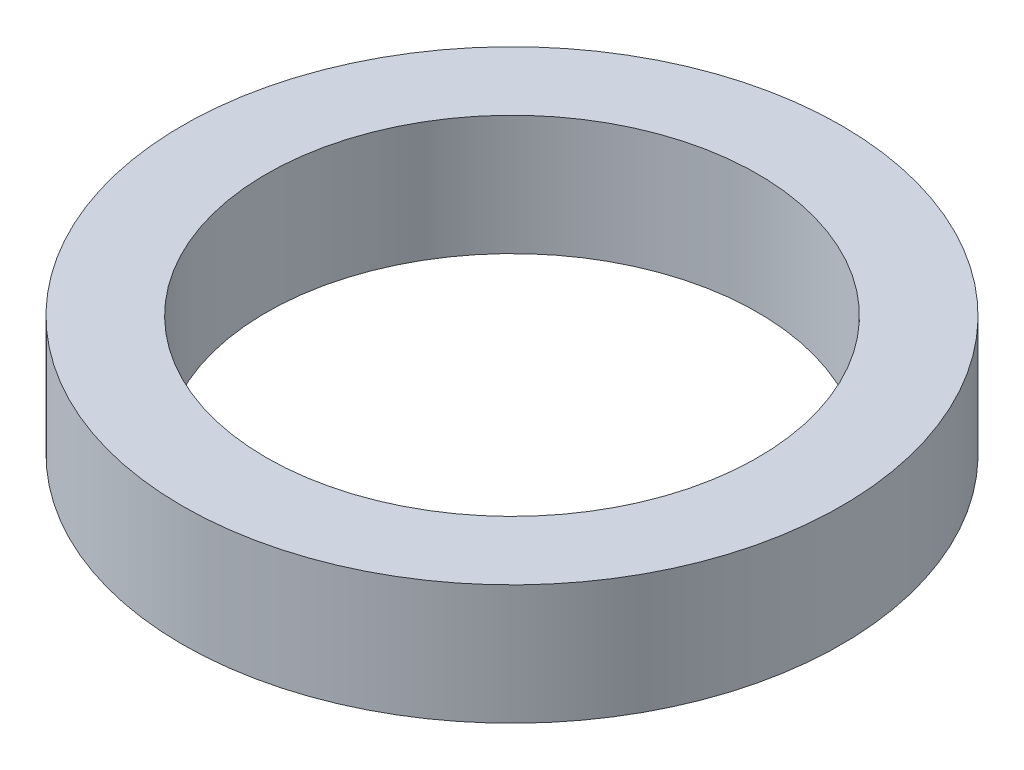
ISO-10303-21;
HEADER;
FILE_DESCRIPTION(('STEP AP214'),'2;1');
FILE_NAME('part.step','',(''),(''),'','','');
FILE_SCHEMA(('AUTOMOTIVE_DESIGN { 1 0 10303 214 1 1 1 1 }'));
ENDSEC;
DATA;
#1=APPLICATION_CONTEXT('core data for automotive mechanical design processes');
#2=APPLICATION_PROTOCOL_DEFINITION('international standard','automotive_design',2000,#1);
#3=PRODUCT_CONTEXT('',#1,'mechanical');
#4=PRODUCT('Part','Part','',(#3));
#5=PRODUCT_RELATED_PRODUCT_CATEGORY('part','',(#4));
#6=PRODUCT_DEFINITION_FORMATION('','',#4);
#7=PRODUCT_DEFINITION_CONTEXT('part definition',#1,'design');
#8=PRODUCT_DEFINITION('design','',#6,#7);
#9=PRODUCT_DEFINITION_SHAPE('','',#8);
#10=(LENGTH_UNIT() NAMED_UNIT(*) SI_UNIT(.MILLI.,.METRE.));
#11=(NAMED_UNIT(*) PLANE_ANGLE_UNIT() SI_UNIT($,.RADIAN.));
#12=(NAMED_UNIT(*) SI_UNIT($,.STERADIAN.) SOLID_ANGLE_UNIT());
#13=UNCERTAINTY_MEASURE_WITH_UNIT(LENGTH_MEASURE(1.E-05),#10,'distance_accuracy_value','');
#14=(GEOMETRIC_REPRESENTATION_CONTEXT(3) GLOBAL_UNCERTAINTY_ASSIGNED_CONTEXT((#13)) GLOBAL_UNIT_ASSIGNED_CONTEXT((#10,
#11,#12)) REPRESENTATION_CONTEXT('',''));
#15=CARTESIAN_POINT('',(0.,0.,0.));
#16=DIRECTION('',(0.,0.,1.));
#17=DIRECTION('',(1.,0.,0.));
#18=AXIS2_PLACEMENT_3D('',#15,#16,#17);
#19=CARTESIAN_POINT('',(0.,1.,0.));
#20=DIRECTION('',(0.,1.,0.));
#21=DIRECTION('',(0.,0.,1.));
#22=AXIS2_PLACEMENT_3D('',#19,#20,#21);
#23=PLANE('',#22);
#24=CARTESIAN_POINT('',(0.,1.,0.));
#25=DIRECTION('',(0.,1.,0.));
#26=DIRECTION('',(0.,0.,1.));
#27=AXIS2_PLACEMENT_3D('',#24,#25,#26);
#28=CIRCLE('',#27,2.75);
#29=CARTESIAN_POINT('',(0.,1.,2.75));
#30=VERTEX_POINT('',#29);
#31=EDGE_CURVE('E10',#30,#30,#28,.T.);
#32=ORIENTED_EDGE('',*,*,#31,.T.);
#33=EDGE_LOOP('',(#32));
#34=FACE_BOUND('',#33,.T.);
#35=CARTESIAN_POINT('',(0.,1.,0.));
#36=DIRECTION('',(0.,1.,0.));
#37=DIRECTION('',(0.,0.,1.));
#38=AXIS2_PLACEMENT_3D('',#35,#36,#37);
#39=CIRCLE('',#38,2.05);
#40=CARTESIAN_POINT('',(0.,1.,2.05));
#41=VERTEX_POINT('',#40);
#42=EDGE_CURVE('E42',#41,#41,#39,.T.);
#43=ORIENTED_EDGE('',*,*,#42,.F.);
#44=EDGE_LOOP('',(#43));
#45=FACE_BOUND('',#44,.T.);
#46=ADVANCED_FACE('F31',(#34,#45),#23,.T.);
#47=CARTESIAN_POINT('',(0.,0.,0.));
#48=DIRECTION('',(0.,1.,0.));
#49=DIRECTION('',(0.,0.,1.));
#50=AXIS2_PLACEMENT_3D('',#47,#48,#49);
#51=PLANE('',#50);
#52=CARTESIAN_POINT('',(0.,0.,0.));
#53=DIRECTION('',(0.,1.,0.));
#54=DIRECTION('',(0.,0.,1.));
#55=AXIS2_PLACEMENT_3D('',#52,#53,#54);
#56=CIRCLE('',#55,2.75);
#57=CARTESIAN_POINT('',(0.,0.,2.75));
#58=VERTEX_POINT('',#57);
#59=EDGE_CURVE('E35',#58,#58,#56,.T.);
#60=ORIENTED_EDGE('',*,*,#59,.F.);
#61=EDGE_LOOP('',(#60));
#62=FACE_BOUND('',#61,.T.);
#63=CARTESIAN_POINT('',(0.,0.,0.));
#64=DIRECTION('',(0.,1.,0.));
#65=DIRECTION('',(0.,0.,1.));
#66=AXIS2_PLACEMENT_3D('',#63,#64,#65);
#67=CIRCLE('',#66,2.05);
#68=CARTESIAN_POINT('',(0.,0.,2.05));
#69=VERTEX_POINT('',#68);
#70=EDGE_CURVE('E44',#69,#69,#67,.T.);
#71=ORIENTED_EDGE('',*,*,#70,.T.);
#72=EDGE_LOOP('',(#71));
#73=FACE_BOUND('',#72,.T.);
#74=ADVANCED_FACE('F54',(#62,#73),#51,.F.);
#75=CARTESIAN_POINT('',(0.,1.,0.));
#76=DIRECTION('',(0.,-1.,0.));
#77=DIRECTION('',(0.,0.,-1.));
#78=AXIS2_PLACEMENT_3D('',#75,#76,#77);
#79=CYLINDRICAL_SURFACE('',#78,2.75);
#80=ORIENTED_EDGE('',*,*,#31,.F.);
#81=EDGE_LOOP('',(#80));
#82=FACE_BOUND('',#81,.T.);
#83=ORIENTED_EDGE('',*,*,#59,.T.);
#84=EDGE_LOOP('',(#83));
#85=FACE_BOUND('',#84,.T.);
#86=ADVANCED_FACE('F33',(#82,#85),#79,.T.);
#87=CARTESIAN_POINT('',(0.,1.,0.));
#88=DIRECTION('',(0.,-1.,0.));
#89=DIRECTION('',(0.,0.,-1.));
#90=AXIS2_PLACEMENT_3D('',#87,#88,#89);
#91=CYLINDRICAL_SURFACE('',#90,2.05);
#92=ORIENTED_EDGE('',*,*,#42,.T.);
#93=EDGE_LOOP('',(#92));
#94=FACE_BOUND('',#93,.T.);
#95=ORIENTED_EDGE('',*,*,#70,.F.);
#96=EDGE_LOOP('',(#95));
#97=FACE_BOUND('',#96,.T.);
#98=ADVANCED_FACE('F50',(#94,#97),#91,.F.);
#99=CLOSED_SHELL('',(#46,#74,#86,#98));
#100=MANIFOLD_SOLID_BREP('B2',#99);
#101=ADVANCED_BREP_SHAPE_REPRESENTATION('',(#18,#100),#14);
#102=SHAPE_DEFINITION_REPRESENTATION(#9,#101);
ENDSEC;
END-ISO-10303-21;
